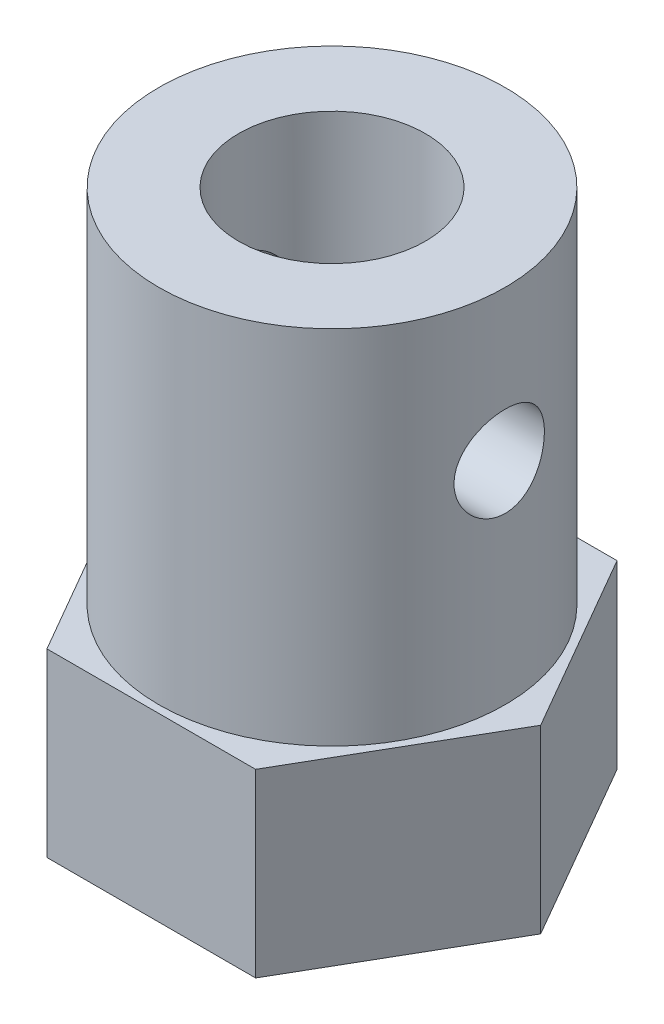
ISO-10303-21;
HEADER;
FILE_DESCRIPTION(('STEP AP214'),'2;1');
FILE_NAME('part.step','',(''),(''),'','','');
FILE_SCHEMA(('AUTOMOTIVE_DESIGN { 1 0 10303 214 1 1 1 1 }'));
ENDSEC;
DATA;
#1=APPLICATION_CONTEXT('core data for automotive mechanical design processes');
#2=APPLICATION_PROTOCOL_DEFINITION('international standard','automotive_design',2000,#1);
#3=PRODUCT_CONTEXT('',#1,'mechanical');
#4=PRODUCT('Part','Part','',(#3));
#5=PRODUCT_RELATED_PRODUCT_CATEGORY('part','',(#4));
#6=PRODUCT_DEFINITION_FORMATION('','',#4);
#7=PRODUCT_DEFINITION_CONTEXT('part definition',#1,'design');
#8=PRODUCT_DEFINITION('design','',#6,#7);
#9=PRODUCT_DEFINITION_SHAPE('','',#8);
#10=(LENGTH_UNIT() NAMED_UNIT(*) SI_UNIT(.MILLI.,.METRE.));
#11=(NAMED_UNIT(*) PLANE_ANGLE_UNIT() SI_UNIT($,.RADIAN.));
#12=(NAMED_UNIT(*) SI_UNIT($,.STERADIAN.) SOLID_ANGLE_UNIT());
#13=UNCERTAINTY_MEASURE_WITH_UNIT(LENGTH_MEASURE(1.E-05),#10,'distance_accuracy_value','');
#14=(GEOMETRIC_REPRESENTATION_CONTEXT(3) GLOBAL_UNCERTAINTY_ASSIGNED_CONTEXT((#13)) GLOBAL_UNIT_ASSIGNED_CONTEXT((#10,
#11,#12)) REPRESENTATION_CONTEXT('',''));
#15=CARTESIAN_POINT('',(0.,0.,0.));
#16=DIRECTION('',(0.,0.,1.));
#17=DIRECTION('',(1.,0.,0.));
#18=AXIS2_PLACEMENT_3D('',#15,#16,#17);
#19=CARTESIAN_POINT('',(0.,6.,0.));
#20=DIRECTION('',(0.,1.,0.));
#21=DIRECTION('',(0.,0.,1.));
#22=AXIS2_PLACEMENT_3D('',#19,#20,#21);
#23=PLANE('',#22);
#24=CARTESIAN_POINT('',(0.,6.,0.));
#25=DIRECTION('',(0.,1.,0.));
#26=DIRECTION('',(0.,0.,1.));
#27=AXIS2_PLACEMENT_3D('',#24,#25,#26);
#28=CIRCLE('',#27,1.5);
#29=CARTESIAN_POINT('',(0.,6.,1.5));
#30=VERTEX_POINT('',#29);
#31=EDGE_CURVE('E132',#30,#30,#28,.T.);
#32=ORIENTED_EDGE('',*,*,#31,.F.);
#33=EDGE_LOOP('',(#32));
#34=FACE_BOUND('',#33,.T.);
#35=CARTESIAN_POINT('',(0.,6.,0.));
#36=DIRECTION('',(0.,1.,0.));
#37=DIRECTION('',(0.,0.,1.));
#38=AXIS2_PLACEMENT_3D('',#35,#36,#37);
#39=CIRCLE('',#38,3.1);
#40=CARTESIAN_POINT('',(0.,6.,3.1));
#41=VERTEX_POINT('',#40);
#42=EDGE_CURVE('E218',#41,#41,#39,.T.);
#43=ORIENTED_EDGE('',*,*,#42,.T.);
#44=EDGE_LOOP('',(#43));
#45=FACE_BOUND('',#44,.T.);
#46=ADVANCED_FACE('F35',(#34,#45),#23,.T.);
#47=CARTESIAN_POINT('',(0.,6.,0.));
#48=DIRECTION('',(0.,1.,0.));
#49=DIRECTION('',(0.,0.,1.));
#50=AXIS2_PLACEMENT_3D('',#47,#48,#49);
#51=CIRCLE('',#50,5.75);
#52=CARTESIAN_POINT('',(0.,6.,5.75));
#53=VERTEX_POINT('',#52);
#54=EDGE_CURVE('E11',#53,#53,#51,.T.);
#55=ORIENTED_EDGE('',*,*,#54,.F.);
#56=EDGE_LOOP('',(#55));
#57=FACE_BOUND('',#56,.T.);
#58=DIRECTION('',(0.499999999999995,0.,-0.866025403784442));
#59=VECTOR('',#58,1.);
#60=CARTESIAN_POINT('',(3.46410161513783,6.,5.99999999999996));
#61=LINE('',#60,#59);
#62=CARTESIAN_POINT('',(3.46410161513783,6.,5.99999999999996));
#63=VERTEX_POINT('',#62);
#64=CARTESIAN_POINT('',(6.92820323027551,6.,0.));
#65=VERTEX_POINT('',#64);
#66=EDGE_CURVE('E139',#63,#65,#61,.T.);
#67=ORIENTED_EDGE('',*,*,#66,.T.);
#68=DIRECTION('',(-0.500000000000001,0.,-0.866025403784438));
#69=VECTOR('',#68,1.);
#70=CARTESIAN_POINT('',(6.92820323027551,6.,0.));
#71=LINE('',#70,#69);
#72=CARTESIAN_POINT('',(3.46410161513774,6.,-6.00000000000001));
#73=VERTEX_POINT('',#72);
#74=EDGE_CURVE('E97',#65,#73,#71,.T.);
#75=ORIENTED_EDGE('',*,*,#74,.T.);
#76=DIRECTION('',(-1.,0.,0.));
#77=VECTOR('',#76,1.);
#78=CARTESIAN_POINT('',(3.46410161513774,6.,-6.00000000000001));
#79=LINE('',#78,#77);
#80=CARTESIAN_POINT('',(-3.46410161513778,6.,-5.99999999999999));
#81=VERTEX_POINT('',#80);
#82=EDGE_CURVE('E110',#73,#81,#79,.T.);
#83=ORIENTED_EDGE('',*,*,#82,.T.);
#84=DIRECTION('',(-0.499999999999995,0.,0.866025403784442));
#85=VECTOR('',#84,1.);
#86=CARTESIAN_POINT('',(-3.46410161513778,6.,-5.99999999999999));
#87=LINE('',#86,#85);
#88=CARTESIAN_POINT('',(-6.92820323027551,6.,0.));
#89=VERTEX_POINT('',#88);
#90=EDGE_CURVE('E104',#81,#89,#87,.T.);
#91=ORIENTED_EDGE('',*,*,#90,.T.);
#92=DIRECTION('',(0.500000000000007,0.,0.866025403784434));
#93=VECTOR('',#92,1.);
#94=CARTESIAN_POINT('',(-6.92820323027551,6.,0.));
#95=LINE('',#94,#93);
#96=CARTESIAN_POINT('',(-3.4641016151377,6.,6.00000000000004));
#97=VERTEX_POINT('',#96);
#98=EDGE_CURVE('E108',#89,#97,#95,.T.);
#99=ORIENTED_EDGE('',*,*,#98,.T.);
#100=DIRECTION('',(1.,0.,0.));
#101=VECTOR('',#100,1.);
#102=CARTESIAN_POINT('',(-3.4641016151377,6.,6.00000000000004));
#103=LINE('',#102,#101);
#104=EDGE_CURVE('E59',#97,#63,#103,.T.);
#105=ORIENTED_EDGE('',*,*,#104,.T.);
#106=EDGE_LOOP('',(#67,#75,#83,#91,#99,#105));
#107=FACE_BOUND('',#106,.T.);
#108=ADVANCED_FACE('F106',(#57,#107),#23,.T.);
#109=CARTESIAN_POINT('',(0.,0.,0.));
#110=DIRECTION('',(0.,1.,0.));
#111=DIRECTION('',(0.,0.,1.));
#112=AXIS2_PLACEMENT_3D('',#109,#110,#111);
#113=PLANE('',#112);
#114=DIRECTION('',(0.499999999999995,0.,-0.866025403784442));
#115=VECTOR('',#114,1.);
#116=CARTESIAN_POINT('',(3.46410161513783,0.,5.99999999999996));
#117=LINE('',#116,#115);
#118=CARTESIAN_POINT('',(3.46410161513783,0.,5.99999999999996));
#119=VERTEX_POINT('',#118);
#120=CARTESIAN_POINT('',(6.92820323027551,0.,0.));
#121=VERTEX_POINT('',#120);
#122=EDGE_CURVE('E128',#119,#121,#117,.T.);
#123=ORIENTED_EDGE('',*,*,#122,.F.);
#124=DIRECTION('',(1.,0.,0.));
#125=VECTOR('',#124,1.);
#126=CARTESIAN_POINT('',(-3.4641016151377,0.,6.00000000000004));
#127=LINE('',#126,#125);
#128=CARTESIAN_POINT('',(-3.4641016151377,0.,6.00000000000004));
#129=VERTEX_POINT('',#128);
#130=EDGE_CURVE('E88',#129,#119,#127,.T.);
#131=ORIENTED_EDGE('',*,*,#130,.F.);
#132=DIRECTION('',(0.500000000000007,0.,0.866025403784434));
#133=VECTOR('',#132,1.);
#134=CARTESIAN_POINT('',(-6.92820323027551,0.,0.));
#135=LINE('',#134,#133);
#136=CARTESIAN_POINT('',(-6.92820323027551,0.,0.));
#137=VERTEX_POINT('',#136);
#138=EDGE_CURVE('E82',#137,#129,#135,.T.);
#139=ORIENTED_EDGE('',*,*,#138,.F.);
#140=DIRECTION('',(-0.499999999999995,0.,0.866025403784442));
#141=VECTOR('',#140,1.);
#142=CARTESIAN_POINT('',(-3.46410161513778,0.,-5.99999999999999));
#143=LINE('',#142,#141);
#144=CARTESIAN_POINT('',(-3.46410161513778,0.,-5.99999999999999));
#145=VERTEX_POINT('',#144);
#146=EDGE_CURVE('E118',#145,#137,#143,.T.);
#147=ORIENTED_EDGE('',*,*,#146,.F.);
#148=DIRECTION('',(-1.,0.,0.));
#149=VECTOR('',#148,1.);
#150=CARTESIAN_POINT('',(3.46410161513774,0.,-6.00000000000001));
#151=LINE('',#150,#149);
#152=CARTESIAN_POINT('',(3.46410161513774,0.,-6.00000000000001));
#153=VERTEX_POINT('',#152);
#154=EDGE_CURVE('E134',#153,#145,#151,.T.);
#155=ORIENTED_EDGE('',*,*,#154,.F.);
#156=DIRECTION('',(-0.500000000000001,0.,-0.866025403784438));
#157=VECTOR('',#156,1.);
#158=CARTESIAN_POINT('',(6.92820323027551,0.,0.));
#159=LINE('',#158,#157);
#160=EDGE_CURVE('E131',#121,#153,#159,.T.);
#161=ORIENTED_EDGE('',*,*,#160,.F.);
#162=EDGE_LOOP('',(#123,#131,#139,#147,#155,#161));
#163=FACE_BOUND('',#162,.T.);
#164=CARTESIAN_POINT('',(0.,0.,0.));
#165=DIRECTION('',(0.,1.,0.));
#166=DIRECTION('',(0.,0.,1.));
#167=AXIS2_PLACEMENT_3D('',#164,#165,#166);
#168=CIRCLE('',#167,1.5);
#169=CARTESIAN_POINT('',(0.,0.,1.5));
#170=VERTEX_POINT('',#169);
#171=EDGE_CURVE('E227',#170,#170,#168,.T.);
#172=ORIENTED_EDGE('',*,*,#171,.T.);
#173=EDGE_LOOP('',(#172));
#174=FACE_BOUND('',#173,.T.);
#175=ADVANCED_FACE('F189',(#163,#174),#113,.F.);
#176=CARTESIAN_POINT('',(3.46410161513783,6.,5.99999999999996));
#177=DIRECTION('',(-0.866025403784441,0.,-0.499999999999995));
#178=DIRECTION('',(-0.499999999999995,0.,0.866025403784442));
#179=AXIS2_PLACEMENT_3D('',#176,#177,#178);
#180=PLANE('',#179);
#181=ORIENTED_EDGE('',*,*,#122,.T.);
#182=DIRECTION('',(0.,-1.,0.));
#183=VECTOR('',#182,1.);
#184=CARTESIAN_POINT('',(6.92820323027551,6.,0.));
#185=LINE('',#184,#183);
#186=EDGE_CURVE('E50',#65,#121,#185,.T.);
#187=ORIENTED_EDGE('',*,*,#186,.F.);
#188=ORIENTED_EDGE('',*,*,#66,.F.);
#189=DIRECTION('',(0.,-1.,0.));
#190=VECTOR('',#189,1.);
#191=CARTESIAN_POINT('',(3.46410161513783,6.,5.99999999999996));
#192=LINE('',#191,#190);
#193=EDGE_CURVE('E124',#63,#119,#192,.T.);
#194=ORIENTED_EDGE('',*,*,#193,.T.);
#195=EDGE_LOOP('',(#181,#187,#188,#194));
#196=FACE_BOUND('',#195,.T.);
#197=ADVANCED_FACE('F37',(#196),#180,.F.);
#198=CARTESIAN_POINT('',(6.92820323027551,6.,0.));
#199=DIRECTION('',(-0.866025403784438,0.,0.500000000000001));
#200=DIRECTION('',(0.500000000000001,0.,0.866025403784438));
#201=AXIS2_PLACEMENT_3D('',#198,#199,#200);
#202=PLANE('',#201);
#203=ORIENTED_EDGE('',*,*,#160,.T.);
#204=DIRECTION('',(0.,-1.,0.));
#205=VECTOR('',#204,1.);
#206=CARTESIAN_POINT('',(3.46410161513774,6.,-6.00000000000001));
#207=LINE('',#206,#205);
#208=EDGE_CURVE('E143',#73,#153,#207,.T.);
#209=ORIENTED_EDGE('',*,*,#208,.F.);
#210=ORIENTED_EDGE('',*,*,#74,.F.);
#211=ORIENTED_EDGE('',*,*,#186,.T.);
#212=EDGE_LOOP('',(#203,#209,#210,#211));
#213=FACE_BOUND('',#212,.T.);
#214=ADVANCED_FACE('F202',(#213),#202,.F.);
#215=CARTESIAN_POINT('',(3.46410161513774,6.,-6.00000000000001));
#216=DIRECTION('',(0.,0.,1.));
#217=DIRECTION('',(1.,0.,0.));
#218=AXIS2_PLACEMENT_3D('',#215,#216,#217);
#219=PLANE('',#218);
#220=ORIENTED_EDGE('',*,*,#154,.T.);
#221=DIRECTION('',(0.,-1.,0.));
#222=VECTOR('',#221,1.);
#223=CARTESIAN_POINT('',(-3.46410161513778,6.,-5.99999999999999));
#224=LINE('',#223,#222);
#225=EDGE_CURVE('E119',#81,#145,#224,.T.);
#226=ORIENTED_EDGE('',*,*,#225,.F.);
#227=ORIENTED_EDGE('',*,*,#82,.F.);
#228=ORIENTED_EDGE('',*,*,#208,.T.);
#229=EDGE_LOOP('',(#220,#226,#227,#228));
#230=FACE_BOUND('',#229,.T.);
#231=ADVANCED_FACE('F200',(#230),#219,.F.);
#232=CARTESIAN_POINT('',(-3.46410161513778,6.,-5.99999999999999));
#233=DIRECTION('',(0.866025403784441,0.,0.499999999999995));
#234=DIRECTION('',(0.499999999999995,0.,-0.866025403784442));
#235=AXIS2_PLACEMENT_3D('',#232,#233,#234);
#236=PLANE('',#235);
#237=ORIENTED_EDGE('',*,*,#146,.T.);
#238=DIRECTION('',(0.,-1.,0.));
#239=VECTOR('',#238,1.);
#240=CARTESIAN_POINT('',(-6.92820323027551,6.,0.));
#241=LINE('',#240,#239);
#242=EDGE_CURVE('E115',#89,#137,#241,.T.);
#243=ORIENTED_EDGE('',*,*,#242,.F.);
#244=ORIENTED_EDGE('',*,*,#90,.F.);
#245=ORIENTED_EDGE('',*,*,#225,.T.);
#246=EDGE_LOOP('',(#237,#243,#244,#245));
#247=FACE_BOUND('',#246,.T.);
#248=ADVANCED_FACE('F116',(#247),#236,.F.);
#249=CARTESIAN_POINT('',(-6.92820323027551,6.,0.));
#250=DIRECTION('',(0.866025403784435,0.,-0.500000000000007));
#251=DIRECTION('',(-0.500000000000007,0.,-0.866025403784435));
#252=AXIS2_PLACEMENT_3D('',#249,#250,#251);
#253=PLANE('',#252);
#254=ORIENTED_EDGE('',*,*,#138,.T.);
#255=DIRECTION('',(0.,-1.,0.));
#256=VECTOR('',#255,1.);
#257=CARTESIAN_POINT('',(-3.4641016151377,6.,6.00000000000004));
#258=LINE('',#257,#256);
#259=EDGE_CURVE('E120',#97,#129,#258,.T.);
#260=ORIENTED_EDGE('',*,*,#259,.F.);
#261=ORIENTED_EDGE('',*,*,#98,.F.);
#262=ORIENTED_EDGE('',*,*,#242,.T.);
#263=EDGE_LOOP('',(#254,#260,#261,#262));
#264=FACE_BOUND('',#263,.T.);
#265=ADVANCED_FACE('F122',(#264),#253,.F.);
#266=CARTESIAN_POINT('',(-3.4641016151377,6.,6.00000000000004));
#267=DIRECTION('',(0.,0.,-1.));
#268=DIRECTION('',(-1.,0.,0.));
#269=AXIS2_PLACEMENT_3D('',#266,#267,#268);
#270=PLANE('',#269);
#271=ORIENTED_EDGE('',*,*,#130,.T.);
#272=ORIENTED_EDGE('',*,*,#193,.F.);
#273=ORIENTED_EDGE('',*,*,#104,.F.);
#274=ORIENTED_EDGE('',*,*,#259,.T.);
#275=EDGE_LOOP('',(#271,#272,#273,#274));
#276=FACE_BOUND('',#275,.T.);
#277=ADVANCED_FACE('F185',(#276),#270,.F.);
#278=CARTESIAN_POINT('',(0.,6.,0.));
#279=DIRECTION('',(0.,-1.,0.));
#280=DIRECTION('',(0.,0.,-1.));
#281=AXIS2_PLACEMENT_3D('',#278,#279,#280);
#282=CYLINDRICAL_SURFACE('',#281,1.5);
#283=ORIENTED_EDGE('',*,*,#31,.T.);
#284=EDGE_LOOP('',(#283));
#285=FACE_BOUND('',#284,.T.);
#286=ORIENTED_EDGE('',*,*,#171,.F.);
#287=EDGE_LOOP('',(#286));
#288=FACE_BOUND('',#287,.T.);
#289=ADVANCED_FACE('F181',(#285,#288),#282,.F.);
#290=CARTESIAN_POINT('',(0.,18.,0.));
#291=DIRECTION('',(0.,1.,0.));
#292=DIRECTION('',(0.,0.,1.));
#293=AXIS2_PLACEMENT_3D('',#290,#291,#292);
#294=PLANE('',#293);
#295=CARTESIAN_POINT('',(0.,18.,0.));
#296=DIRECTION('',(0.,1.,0.));
#297=DIRECTION('',(0.,0.,1.));
#298=AXIS2_PLACEMENT_3D('',#295,#296,#297);
#299=CIRCLE('',#298,5.75);
#300=CARTESIAN_POINT('',(0.,18.,5.75));
#301=VERTEX_POINT('',#300);
#302=EDGE_CURVE('E223',#301,#301,#299,.T.);
#303=ORIENTED_EDGE('',*,*,#302,.T.);
#304=EDGE_LOOP('',(#303));
#305=FACE_BOUND('',#304,.T.);
#306=CARTESIAN_POINT('',(0.,18.,0.));
#307=DIRECTION('',(0.,1.,0.));
#308=DIRECTION('',(0.,0.,1.));
#309=AXIS2_PLACEMENT_3D('',#306,#307,#308);
#310=CIRCLE('',#309,3.1);
#311=CARTESIAN_POINT('',(0.,18.,3.1));
#312=VERTEX_POINT('',#311);
#313=EDGE_CURVE('E220',#312,#312,#310,.T.);
#314=ORIENTED_EDGE('',*,*,#313,.F.);
#315=EDGE_LOOP('',(#314));
#316=FACE_BOUND('',#315,.T.);
#317=ADVANCED_FACE('F179',(#305,#316),#294,.T.);
#318=CARTESIAN_POINT('',(0.,18.,0.));
#319=DIRECTION('',(0.,-1.,0.));
#320=DIRECTION('',(0.,0.,-1.));
#321=AXIS2_PLACEMENT_3D('',#318,#319,#320);
#322=CYLINDRICAL_SURFACE('',#321,5.75);
#323=CARTESIAN_POINT('',(-5.55090082779363,13.,-1.5));
#324=CARTESIAN_POINT('',(-5.55090232081963,13.0827025118796,-1.49999787390871));
#325=CARTESIAN_POINT('',(-5.55276929440346,13.1654278772811,-1.49313699351389));
#326=CARTESIAN_POINT('',(-5.56001429429568,13.328494285914,-1.46592382093821));
#327=CARTESIAN_POINT('',(-5.56539418133612,13.4088340419363,-1.44556437870484));
#328=CARTESIAN_POINT('',(-5.57901516627788,13.5647468235353,-1.39206496813115));
#329=CARTESIAN_POINT('',(-5.58725235690885,13.6403261928731,-1.35894244606875));
#330=CARTESIAN_POINT('',(-5.60565488571894,13.7848659142589,-1.28091123512912));
#331=CARTESIAN_POINT('',(-5.61582034985967,13.8538258334577,-1.23600177621404));
#332=CARTESIAN_POINT('',(-5.63720669027579,13.9848203400384,-1.13452208252607));
#333=CARTESIAN_POINT('',(-5.64844563148391,14.0466729921918,-1.07772075709486));
#334=CARTESIAN_POINT('',(-5.67055638091198,14.1600908276964,-0.954566979277584));
#335=CARTESIAN_POINT('',(-5.68142815233586,14.2116549825083,-0.888213573111866));
#336=CARTESIAN_POINT('',(-5.70178058538213,14.3037856975123,-0.746582977248265));
#337=CARTESIAN_POINT('',(-5.71123744823346,14.3441721440468,-0.671184907061254));
#338=CARTESIAN_POINT('',(-5.72748767458969,14.4116276367408,-0.514381442504879));
#339=CARTESIAN_POINT('',(-5.73428146717266,14.4386988284544,-0.432977018402214));
#340=CARTESIAN_POINT('',(-5.74431235079744,14.4781686910732,-0.268369836538965));
#341=CARTESIAN_POINT('',(-5.74762430604319,14.4908766617071,-0.1852458849922));
#342=CARTESIAN_POINT('',(-5.75057979191644,14.5022316687055,-0.0179843371081629));
#343=CARTESIAN_POINT('',(-5.75022391112532,14.5008809610801,0.0661530944305818));
#344=CARTESIAN_POINT('',(-5.74593898657959,14.4843764114755,0.230903126609591));
#345=CARTESIAN_POINT('',(-5.74209642310203,14.4695566289211,0.311551783947848));
#346=CARTESIAN_POINT('',(-5.73137145288893,14.4270733267933,0.469175376981868));
#347=CARTESIAN_POINT('',(-5.72448887669112,14.3994090912151,0.546150107613409));
#348=CARTESIAN_POINT('',(-5.70832751550622,14.3317611105538,0.695103277024859));
#349=CARTESIAN_POINT('',(-5.6990263029229,14.2916613442095,0.767026490664263));
#350=CARTESIAN_POINT('',(-5.67903225460901,14.2003692607206,0.903237998902984));
#351=CARTESIAN_POINT('',(-5.66833915797082,14.1491748626962,0.967524857741455));
#352=CARTESIAN_POINT('',(-5.64635136172292,14.0353671462552,1.08863222457667));
#353=CARTESIAN_POINT('',(-5.63504821801647,13.9724622554754,1.14517751241556));
#354=CARTESIAN_POINT('',(-5.61339946204995,13.8379452148636,1.24698151059245));
#355=CARTESIAN_POINT('',(-5.60305390313033,13.7663325804967,1.29223959243559));
#356=CARTESIAN_POINT('',(-5.58445905522392,13.6158563577676,1.37038203776097));
#357=CARTESIAN_POINT('',(-5.57622200888616,13.5369538883825,1.40319464637715));
#358=CARTESIAN_POINT('',(-5.56293055858802,13.3744844829647,1.45500060536802));
#359=CARTESIAN_POINT('',(-5.55787540422025,13.2909186517895,1.47399721422912));
#360=CARTESIAN_POINT('',(-5.55167914004583,13.1240609452585,1.49716381835989));
#361=CARTESIAN_POINT('',(-5.55043002233498,13.0408298385871,1.50174307874068));
#362=CARTESIAN_POINT('',(-5.55169228644257,12.874791704668,1.49707006587458));
#363=CARTESIAN_POINT('',(-5.55420328747144,12.7919846353299,1.48781919321403));
#364=CARTESIAN_POINT('',(-5.56259882701457,12.6307016559855,1.45610863559891));
#365=CARTESIAN_POINT('',(-5.56842118691461,12.5521743674906,1.43389221391026));
#366=CARTESIAN_POINT('',(-5.58272327222094,12.3999598290562,1.37715336709783));
#367=CARTESIAN_POINT('',(-5.59120333344621,12.3262731921906,1.34262938675294));
#368=CARTESIAN_POINT('',(-5.61008904341343,12.1841116303205,1.26141546219601));
#369=CARTESIAN_POINT('',(-5.62053162663388,12.1157799033486,1.21448364010067));
#370=CARTESIAN_POINT('',(-5.6420775632124,11.9878114474233,1.11008819917511));
#371=CARTESIAN_POINT('',(-5.65318103499585,11.9281762834623,1.0526226889413));
#372=CARTESIAN_POINT('',(-5.67516745336205,11.8176094483759,0.926903287195877));
#373=CARTESIAN_POINT('',(-5.68603592780608,11.7669623765694,0.858396075371732));
#374=CARTESIAN_POINT('',(-5.70601331478824,11.6778887151307,0.713613484583691));
#375=CARTESIAN_POINT('',(-5.71512232063588,11.639461477377,0.637338517893222));
#376=CARTESIAN_POINT('',(-5.73049601619699,11.5762649912451,0.479720718704235));
#377=CARTESIAN_POINT('',(-5.73678165450386,11.5513948481437,0.398420480930011));
#378=CARTESIAN_POINT('',(-5.745892430293,11.5157219058226,0.232607146509003));
#379=CARTESIAN_POINT('',(-5.74871829927836,11.5049161329262,0.148094732913746));
#380=CARTESIAN_POINT('',(-5.75055825162258,11.4978582656111,-0.019079947133176));
#381=CARTESIAN_POINT('',(-5.74968190891557,11.5011878239951,-0.101723601520388));
#382=CARTESIAN_POINT('',(-5.74446199519655,11.5213394073171,-0.265231316357166));
#383=CARTESIAN_POINT('',(-5.74011854451027,11.5381609640163,-0.346095438465203));
#384=CARTESIAN_POINT('',(-5.72847252230552,11.5845866777533,-0.503268507616826));
#385=CARTESIAN_POINT('',(-5.72118886505798,11.6141092081108,-0.579603059324661));
#386=CARTESIAN_POINT('',(-5.70442589175086,11.6850256400348,-0.726278800625168));
#387=CARTESIAN_POINT('',(-5.69494627833792,11.7264211494965,-0.796619176783412));
#388=CARTESIAN_POINT('',(-5.67450404780893,11.8211511060026,-0.931270439941909));
#389=CARTESIAN_POINT('',(-5.66350955817485,11.8747652445582,-0.99537971119792));
#390=CARTESIAN_POINT('',(-5.64141065929338,11.9918756389475,-1.11383314693391));
#391=CARTESIAN_POINT('',(-5.63030622225617,12.0553744561532,-1.16817477248182));
#392=CARTESIAN_POINT('',(-5.60897994432222,12.1920402595224,-1.2666656342572));
#393=CARTESIAN_POINT('',(-5.59878125079338,12.2653807938219,-1.3105794960216));
#394=CARTESIAN_POINT('',(-5.58074232391792,12.4186604878402,-1.38539021145014));
#395=CARTESIAN_POINT('',(-5.5729004866524,12.4985951126335,-1.41629592335341));
#396=CARTESIAN_POINT('',(-5.56160088605531,12.6485762864125,-1.4599688276234));
#397=CARTESIAN_POINT('',(-5.55762000999737,12.7179478254287,-1.47494618353058));
#398=CARTESIAN_POINT('',(-5.55226947550379,12.8582074149736,-1.49496216858776));
#399=CARTESIAN_POINT('',(-5.55089954775333,12.9290953083301,-1.50000182279648));
#400=CARTESIAN_POINT('',(-5.55090082779363,13.,-1.5));
#401=B_SPLINE_CURVE_WITH_KNOTS('',3,(#323,#324,#325,#326,#327,#328,#329,#330,#331,#332,#333,
#334,#335,#336,#337,#338,#339,#340,#341,#342,#343,#344,#345,#346,#347,#348,#349,#350,#351,#352,
#353,#354,#355,#356,#357,#358,#359,#360,#361,#362,#363,#364,#365,#366,#367,#368,#369,#370,#371,
#372,#373,#374,#375,#376,#377,#378,#379,#380,#381,#382,#383,#384,#385,#386,#387,#388,#389,#390,
#391,#392,#393,#394,#395,#396,#397,#398,#399,#400),.UNSPECIFIED.,.T.,.F.,(4,2,2,2,2,2,2,2,2,2,2,
2,2,2,2,2,2,2,2,2,2,2,2,2,2,2,2,2,2,2,2,2,2,2,2,2,2,2,4),(0.,0.247846932213467,0.49582525145072,
0.743465796519598,0.991122523916576,1.24413298994995,1.49716873674027,1.75407149955015,
2.01093285275295,2.26215074877579,2.51332833223609,2.75844131790607,3.00356796886319,
3.25105414713942,3.49858678350027,3.75340001453818,4.00822743093465,4.26450250455337,
4.52071711639577,4.76958977198248,5.01843722578485,5.26275935549397,5.50711236945145,
5.75663370302619,6.00619988401493,6.26263234557327,6.51905120407021,6.77353474031641,
7.02796446151302,7.27491743805458,7.52186184448271,7.76724235555625,8.01265611292845,
8.26438206043911,8.51617334546956,8.77319910700255,9.03004955584013,9.24256212496342,
9.4550527725935),.UNSPECIFIED.);
#402=CARTESIAN_POINT('',(-5.55090082779363,13.,-1.5));
#403=VERTEX_POINT('',#402);
#404=EDGE_CURVE('E170',#403,#403,#401,.T.);
#405=ORIENTED_EDGE('',*,*,#404,.T.);
#406=EDGE_LOOP('',(#405));
#407=FACE_BOUND('',#406,.T.);
#408=CARTESIAN_POINT('',(5.55090082779363,13.,-1.5));
#409=CARTESIAN_POINT('',(5.55090232081963,12.9172974881204,-1.49999787390871));
#410=CARTESIAN_POINT('',(5.55276929440346,12.8345721227189,-1.49313699351389));
#411=CARTESIAN_POINT('',(5.56001429429568,12.671505714086,-1.46592382093821));
#412=CARTESIAN_POINT('',(5.56539418133612,12.5911659580637,-1.44556437870484));
#413=CARTESIAN_POINT('',(5.57901516627788,12.4352531764647,-1.39206496813115));
#414=CARTESIAN_POINT('',(5.58725235690885,12.3596738071269,-1.35894244606875));
#415=CARTESIAN_POINT('',(5.60565488571894,12.2151340857411,-1.28091123512912));
#416=CARTESIAN_POINT('',(5.61582034985967,12.1461741665423,-1.23600177621404));
#417=CARTESIAN_POINT('',(5.63720669027579,12.0151796599616,-1.13452208252607));
#418=CARTESIAN_POINT('',(5.64844563148391,11.9533270078082,-1.07772075709486));
#419=CARTESIAN_POINT('',(5.67055638091198,11.8399091723036,-0.954566979277584));
#420=CARTESIAN_POINT('',(5.68142815233586,11.7883450174917,-0.888213573111866));
#421=CARTESIAN_POINT('',(5.70178058538213,11.6962143024877,-0.746582977248265));
#422=CARTESIAN_POINT('',(5.71123744823346,11.6558278559532,-0.671184907061254));
#423=CARTESIAN_POINT('',(5.72748767458969,11.5883723632592,-0.514381442504879));
#424=CARTESIAN_POINT('',(5.73428146717266,11.5613011715456,-0.432977018402214));
#425=CARTESIAN_POINT('',(5.74431235079744,11.5218313089268,-0.268369836538965));
#426=CARTESIAN_POINT('',(5.74762430604319,11.5091233382929,-0.1852458849922));
#427=CARTESIAN_POINT('',(5.75057979191644,11.4977683312945,-0.0179843371081629));
#428=CARTESIAN_POINT('',(5.75022391112532,11.4991190389199,0.0661530944305818));
#429=CARTESIAN_POINT('',(5.74593898657959,11.5156235885245,0.230903126609591));
#430=CARTESIAN_POINT('',(5.74209642310203,11.5304433710789,0.311551783947848));
#431=CARTESIAN_POINT('',(5.73137145288893,11.5729266732067,0.469175376981868));
#432=CARTESIAN_POINT('',(5.72448887669112,11.6005909087849,0.546150107613409));
#433=CARTESIAN_POINT('',(5.70832751550622,11.6682388894462,0.695103277024859));
#434=CARTESIAN_POINT('',(5.6990263029229,11.7083386557905,0.767026490664263));
#435=CARTESIAN_POINT('',(5.67903225460901,11.7996307392794,0.903237998902984));
#436=CARTESIAN_POINT('',(5.66833915797082,11.8508251373038,0.967524857741455));
#437=CARTESIAN_POINT('',(5.64635136172292,11.9646328537448,1.08863222457667));
#438=CARTESIAN_POINT('',(5.63504821801647,12.0275377445246,1.14517751241556));
#439=CARTESIAN_POINT('',(5.61339946204995,12.1620547851364,1.24698151059245));
#440=CARTESIAN_POINT('',(5.60305390313033,12.2336674195033,1.29223959243559));
#441=CARTESIAN_POINT('',(5.58445905522392,12.3841436422324,1.37038203776097));
#442=CARTESIAN_POINT('',(5.57622200888616,12.4630461116175,1.40319464637715));
#443=CARTESIAN_POINT('',(5.56293055858802,12.6255155170353,1.45500060536802));
#444=CARTESIAN_POINT('',(5.55787540422025,12.7090813482105,1.47399721422912));
#445=CARTESIAN_POINT('',(5.55167914004583,12.8759390547415,1.49716381835989));
#446=CARTESIAN_POINT('',(5.55043002233498,12.9591701614129,1.50174307874068));
#447=CARTESIAN_POINT('',(5.55169228644257,13.125208295332,1.49707006587458));
#448=CARTESIAN_POINT('',(5.55420328747144,13.2080153646701,1.48781919321403));
#449=CARTESIAN_POINT('',(5.56259882701457,13.3692983440145,1.45610863559891));
#450=CARTESIAN_POINT('',(5.56842118691461,13.4478256325094,1.43389221391026));
#451=CARTESIAN_POINT('',(5.58272327222094,13.6000401709438,1.37715336709783));
#452=CARTESIAN_POINT('',(5.59120333344621,13.6737268078094,1.34262938675294));
#453=CARTESIAN_POINT('',(5.61008904341343,13.8158883696795,1.26141546219601));
#454=CARTESIAN_POINT('',(5.62053162663388,13.8842200966514,1.21448364010067));
#455=CARTESIAN_POINT('',(5.6420775632124,14.0121885525767,1.11008819917511));
#456=CARTESIAN_POINT('',(5.65318103499585,14.0718237165378,1.05262268894129));
#457=CARTESIAN_POINT('',(5.67516745336205,14.1823905516241,0.926903287195877));
#458=CARTESIAN_POINT('',(5.68603592780608,14.2330376234306,0.858396075371732));
#459=CARTESIAN_POINT('',(5.70601331478824,14.3221112848693,0.713613484583691));
#460=CARTESIAN_POINT('',(5.71512232063588,14.360538522623,0.637338517893222));
#461=CARTESIAN_POINT('',(5.73049601619699,14.4237350087549,0.479720718704235));
#462=CARTESIAN_POINT('',(5.73678165450386,14.4486051518563,0.39842048093001));
#463=CARTESIAN_POINT('',(5.745892430293,14.4842780941774,0.232607146509002));
#464=CARTESIAN_POINT('',(5.74871829927836,14.4950838670738,0.148094732913746));
#465=CARTESIAN_POINT('',(5.75055825162258,14.5021417343889,-0.019079947133176));
#466=CARTESIAN_POINT('',(5.74968190891557,14.4988121760049,-0.101723601520388));
#467=CARTESIAN_POINT('',(5.74446199519655,14.4786605926829,-0.265231316357166));
#468=CARTESIAN_POINT('',(5.74011854451027,14.4618390359837,-0.346095438465203));
#469=CARTESIAN_POINT('',(5.72847252230552,14.4154133222467,-0.503268507616826));
#470=CARTESIAN_POINT('',(5.72118886505798,14.3858907918892,-0.579603059324661));
#471=CARTESIAN_POINT('',(5.70442589175086,14.3149743599653,-0.726278800625168));
#472=CARTESIAN_POINT('',(5.69494627833792,14.2735788505035,-0.796619176783412));
#473=CARTESIAN_POINT('',(5.67450404780893,14.1788488939974,-0.931270439941908));
#474=CARTESIAN_POINT('',(5.66350955817485,14.1252347554418,-0.995379711197919));
#475=CARTESIAN_POINT('',(5.64141065929338,14.0081243610525,-1.11383314693391));
#476=CARTESIAN_POINT('',(5.63030622225617,13.9446255438468,-1.16817477248182));
#477=CARTESIAN_POINT('',(5.60897994432222,13.8079597404776,-1.2666656342572));
#478=CARTESIAN_POINT('',(5.59878125079338,13.7346192061781,-1.3105794960216));
#479=CARTESIAN_POINT('',(5.58074232391792,13.5813395121598,-1.38539021145014));
#480=CARTESIAN_POINT('',(5.5729004866524,13.5014048873665,-1.41629592335341));
#481=CARTESIAN_POINT('',(5.56160088605531,13.3514237135875,-1.4599688276234));
#482=CARTESIAN_POINT('',(5.55762000999737,13.2820521745713,-1.47494618353058));
#483=CARTESIAN_POINT('',(5.55226947550379,13.1417925850264,-1.49496216858776));
#484=CARTESIAN_POINT('',(5.55089954775333,13.0709046916699,-1.50000182279648));
#485=CARTESIAN_POINT('',(5.55090082779363,13.,-1.5));
#486=B_SPLINE_CURVE_WITH_KNOTS('',3,(#408,#409,#410,#411,#412,#413,#414,#415,#416,#417,#418,
#419,#420,#421,#422,#423,#424,#425,#426,#427,#428,#429,#430,#431,#432,#433,#434,#435,#436,#437,
#438,#439,#440,#441,#442,#443,#444,#445,#446,#447,#448,#449,#450,#451,#452,#453,#454,#455,#456,
#457,#458,#459,#460,#461,#462,#463,#464,#465,#466,#467,#468,#469,#470,#471,#472,#473,#474,#475,
#476,#477,#478,#479,#480,#481,#482,#483,#484,#485),.UNSPECIFIED.,.T.,.F.,(4,2,2,2,2,2,2,2,2,2,2,
2,2,2,2,2,2,2,2,2,2,2,2,2,2,2,2,2,2,2,2,2,2,2,2,2,2,2,4),(0.,0.247846932213467,0.49582525145072,
0.743465796519596,0.991122523916576,1.24413298994995,1.49716873674027,1.75407149955015,
2.01093285275295,2.26215074877579,2.51332833223609,2.75844131790607,3.00356796886319,
3.25105414713942,3.49858678350027,3.75340001453818,4.00822743093465,4.26450250455337,
4.52071711639577,4.76958977198248,5.01843722578485,5.26275935549397,5.50711236945145,
5.75663370302619,6.00619988401493,6.26263234557327,6.51905120407021,6.77353474031641,
7.02796446151302,7.27491743805458,7.52186184448271,7.76724235555625,8.01265611292845,
8.26438206043911,8.51617334546956,8.77319910700255,9.03004955584013,9.24256212496342,
9.4550527725935),.UNSPECIFIED.);
#487=CARTESIAN_POINT('',(5.55090082779363,13.,-1.5));
#488=VERTEX_POINT('',#487);
#489=EDGE_CURVE('E164',#488,#488,#486,.T.);
#490=ORIENTED_EDGE('',*,*,#489,.T.);
#491=EDGE_LOOP('',(#490));
#492=FACE_BOUND('',#491,.T.);
#493=ORIENTED_EDGE('',*,*,#302,.F.);
#494=EDGE_LOOP('',(#493));
#495=FACE_BOUND('',#494,.T.);
#496=ORIENTED_EDGE('',*,*,#54,.T.);
#497=EDGE_LOOP('',(#496));
#498=FACE_BOUND('',#497,.T.);
#499=ADVANCED_FACE('F175',(#407,#492,#495,#498),#322,.T.);
#500=CARTESIAN_POINT('',(0.,18.,0.));
#501=DIRECTION('',(0.,-1.,0.));
#502=DIRECTION('',(0.,0.,-1.));
#503=AXIS2_PLACEMENT_3D('',#500,#501,#502);
#504=CYLINDRICAL_SURFACE('',#503,3.1);
#505=CARTESIAN_POINT('',(-2.71293199325011,13.,-1.5));
#506=CARTESIAN_POINT('',(-2.71293810602707,13.0785466190489,-1.49999492059757));
#507=CARTESIAN_POINT('',(-2.71639437877482,13.1572010979134,-1.49378977985908));
#508=CARTESIAN_POINT('',(-2.72972979584767,13.3121268096355,-1.46927137742174));
#509=CARTESIAN_POINT('',(-2.73962329586937,13.3883923154249,-1.45093105142698));
#510=CARTESIAN_POINT('',(-2.76442252776009,13.5360104557441,-1.4030976209863));
#511=CARTESIAN_POINT('',(-2.7793028937549,13.6073857945719,-1.37366086619922));
#512=CARTESIAN_POINT('',(-2.81236022577533,13.744167543615,-1.30464150179683));
#513=CARTESIAN_POINT('',(-2.83053718481149,13.8095739664851,-1.26505891369269));
#514=CARTESIAN_POINT('',(-2.86985264094388,13.9381288898871,-1.17329480013247));
#515=CARTESIAN_POINT('',(-2.89111140167802,14.0007160087334,-1.12037798569234));
#516=CARTESIAN_POINT('',(-2.93322157526014,14.1165592753543,-1.00497971934906));
#517=CARTESIAN_POINT('',(-2.95407279148337,14.169811013306,-0.942493773175669));
#518=CARTESIAN_POINT('',(-2.99457001608098,14.2687047128331,-0.804980520744669));
#519=CARTESIAN_POINT('',(-3.01406059193925,14.3136680786481,-0.729415143076342));
#520=CARTESIAN_POINT('',(-3.04809814226509,14.389990278621,-0.57067389312141));
#521=CARTESIAN_POINT('',(-3.06264804171259,14.4213571652207,-0.487502560865867));
#522=CARTESIAN_POINT('',(-3.08430127904169,14.4674121349187,-0.321847709467145));
#523=CARTESIAN_POINT('',(-3.09184014117435,14.483081247722,-0.239695127397445));
#524=CARTESIAN_POINT('',(-3.10023882355099,14.5005142175406,-0.0736068203923163));
#525=CARTESIAN_POINT('',(-3.10110239470556,14.5022858836739,0.0103278765621611));
#526=CARTESIAN_POINT('',(-3.09627020423456,14.4922805692293,0.17027324970091));
#527=CARTESIAN_POINT('',(-3.09110371985573,14.4815969190373,0.246371834339658));
#528=CARTESIAN_POINT('',(-3.07557700513506,14.4489237110783,0.395538468369625));
#529=CARTESIAN_POINT('',(-3.06521638788366,14.4269333110715,0.468606291561162));
#530=CARTESIAN_POINT('',(-3.04007288157933,14.3720945793857,0.610951104347792));
#531=CARTESIAN_POINT('',(-3.02522825824131,14.339093952707,0.680158065694272));
#532=CARTESIAN_POINT('',(-2.99247817620383,14.263364640628,0.812225689942346));
#533=CARTESIAN_POINT('',(-2.97457160394644,14.2206324141938,0.875084030725966));
#534=CARTESIAN_POINT('',(-2.9355013363418,14.1222242480428,0.99870062036054));
#535=CARTESIAN_POINT('',(-2.91418954377451,14.065729600631,1.05876095216352));
#536=CARTESIAN_POINT('',(-2.87178037530514,13.9436105636561,1.16891768527135));
#537=CARTESIAN_POINT('',(-2.85068315560029,13.8779799719361,1.21900726107665));
#538=CARTESIAN_POINT('',(-2.80982104768052,13.7348812140856,1.31055794759544));
#539=CARTESIAN_POINT('',(-2.79019907829767,13.6569533844546,1.35137051946412));
#540=CARTESIAN_POINT('',(-2.75642605801252,13.494154978374,1.41899941443367));
#541=CARTESIAN_POINT('',(-2.74226961836549,13.4092913408643,1.44582953272961));
#542=CARTESIAN_POINT('',(-2.72253482573975,13.2419640079642,1.48263666296822));
#543=CARTESIAN_POINT('',(-2.71637771942639,13.1598223116837,1.49375661147253));
#544=CARTESIAN_POINT('',(-2.71168425392407,12.9946341778727,1.50226461760217));
#545=CARTESIAN_POINT('',(-2.71314324594875,12.9115883231189,1.49966105190683));
#546=CARTESIAN_POINT('',(-2.72290566354281,12.7557134756923,1.48184467777125));
#547=CARTESIAN_POINT('',(-2.73051559969672,12.6826883387706,1.4679086290649));
#548=CARTESIAN_POINT('',(-2.75072559786317,12.5401340335372,1.42967569872823));
#549=CARTESIAN_POINT('',(-2.76332715574048,12.4706059202418,1.40537571111578));
#550=CARTESIAN_POINT('',(-2.7927932466317,12.3333656467137,1.3459017726769));
#551=CARTESIAN_POINT('',(-2.80982847144386,12.265887492483,1.31027553001639));
#552=CARTESIAN_POINT('',(-2.84607243783817,12.1374863450809,1.2295640127949));
#553=CARTESIAN_POINT('',(-2.86528227864574,12.0765666977324,1.18447394453352));
#554=CARTESIAN_POINT('',(-2.90640342115472,11.9555929312464,1.07996442995556));
#555=CARTESIAN_POINT('',(-2.92836871534928,11.8964665217204,1.01948756982411));
#556=CARTESIAN_POINT('',(-2.97056031612546,11.788935518112,0.889081601811071));
#557=CARTESIAN_POINT('',(-2.99078614869189,11.7405338409633,0.819149930698388));
#558=CARTESIAN_POINT('',(-3.02777065360343,11.6550417163606,0.669801398703177));
#559=CARTESIAN_POINT('',(-3.04445053122811,11.6182010695642,0.590220688077679));
#560=CARTESIAN_POINT('',(-3.07187356547455,11.5587827344077,0.424953967870415));
#561=CARTESIAN_POINT('',(-3.08262160180212,11.5361933203715,0.339273042215534));
#562=CARTESIAN_POINT('',(-3.09623602551114,11.5077479012071,0.17236773997227));
#563=CARTESIAN_POINT('',(-3.099711970682,11.5005959807145,0.0914132929018959));
#564=CARTESIAN_POINT('',(-3.10025308480683,11.4994762388257,-0.0705970615455868));
#565=CARTESIAN_POINT('',(-3.0973202193951,11.5055043749992,-0.151652930195125));
#566=CARTESIAN_POINT('',(-3.08572788901491,11.5296878864898,-0.306535872374835));
#567=CARTESIAN_POINT('',(-3.07741733526782,11.5471050106366,-0.380506967606489));
#568=CARTESIAN_POINT('',(-3.05619391816196,11.5926175539226,-0.524375894010134));
#569=CARTESIAN_POINT('',(-3.04328035300466,11.6207146014205,-0.594273102164778));
#570=CARTESIAN_POINT('',(-3.01332001683357,11.6881128500991,-0.731472536634641));
#571=CARTESIAN_POINT('',(-2.9961154438214,11.7278553825869,-0.798522504117894));
#572=CARTESIAN_POINT('',(-2.95942590784808,11.8168497696559,-0.925289323220526));
#573=CARTESIAN_POINT('',(-2.93993989882688,11.8661059931324,-0.985002785063891));
#574=CARTESIAN_POINT('',(-2.89850357205403,11.9781008895886,-1.10128775860753));
#575=CARTESIAN_POINT('',(-2.87649347823812,12.0416705873503,-1.15704001821865));
#576=CARTESIAN_POINT('',(-2.83408562289403,12.1776796270469,-1.25735148728903));
#577=CARTESIAN_POINT('',(-2.81368914756881,12.2501259295331,-1.30190182818343));
#578=CARTESIAN_POINT('',(-2.77658650994691,12.4040715724344,-1.37929552477));
#579=CARTESIAN_POINT('',(-2.7599725949942,12.4857365286417,-1.41185622470861));
#580=CARTESIAN_POINT('',(-2.73360384914068,12.6543898667148,-1.4622728069576));
#581=CARTESIAN_POINT('',(-2.72382602374533,12.7413593219111,-1.48017802084133));
#582=CARTESIAN_POINT('',(-2.7165154455489,12.8576358542283,-1.49350264095651));
#583=CARTESIAN_POINT('',(-2.71517570481292,12.8860322254294,-1.49593586787793));
#584=CARTESIAN_POINT('',(-2.71338284202488,12.9429476484937,-1.4991855180506));
#585=CARTESIAN_POINT('',(-2.71292977268791,12.9714667075501,-1.50000184517267));
#586=CARTESIAN_POINT('',(-2.71293199325011,13.,-1.5));
#587=B_SPLINE_CURVE_WITH_KNOTS('',3,(#505,#506,#507,#508,#509,#510,#511,#512,#513,#514,#515,
#516,#517,#518,#519,#520,#521,#522,#523,#524,#525,#526,#527,#528,#529,#530,#531,#532,#533,#534,
#535,#536,#537,#538,#539,#540,#541,#542,#543,#544,#545,#546,#547,#548,#549,#550,#551,#552,#553,
#554,#555,#556,#557,#558,#559,#560,#561,#562,#563,#564,#565,#566,#567,#568,#569,#570,#571,#572,
#573,#574,#575,#576,#577,#578,#579,#580,#581,#582,#583,#584,#585,#586),.UNSPECIFIED.,.T.,.F.,(4,
2,2,2,2,2,2,2,2,2,2,2,2,2,2,2,2,2,2,2,2,2,2,2,2,2,2,2,2,2,2,2,2,2,2,2,2,2,2,2,4),(0.,
0.235519909494816,0.471566861867468,0.706430929695081,0.941294499568247,1.19423736348462,
1.4472993918053,1.7160884568173,1.98471811471995,2.23525571200081,2.48565251954049,
2.71562530273618,2.94561521908867,3.17892825434239,3.41232632115822,3.66672597203251,
3.9212991782552,4.19027593547098,4.45898681336751,4.70691557051381,4.95469301225538,
5.1778852290003,5.4011443815597,5.63476423123155,5.86850270291336,6.12947262056348,
6.39051343043701,6.65685802537525,6.92298318964468,7.16572463042057,7.40839163087321,
7.6367080116984,7.8650592176999,8.10352972246076,8.34210999959678,8.6030549964481,
8.86420593768663,9.13116977898829,9.39723125898447,9.48278247736158,9.56833878184367),.UNSPECIFIED.);
#588=CARTESIAN_POINT('',(-2.71293199325011,13.,-1.5));
#589=VERTEX_POINT('',#588);
#590=EDGE_CURVE('E39',#589,#589,#587,.T.);
#591=ORIENTED_EDGE('',*,*,#590,.F.);
#592=EDGE_LOOP('',(#591));
#593=FACE_BOUND('',#592,.T.);
#594=CARTESIAN_POINT('',(2.71293199325011,13.,-1.5));
#595=CARTESIAN_POINT('',(2.71293810602707,12.9214533809511,-1.49999492059757));
#596=CARTESIAN_POINT('',(2.71639437877482,12.8427989020866,-1.49378977985908));
#597=CARTESIAN_POINT('',(2.72972979584767,12.6878731903645,-1.46927137742174));
#598=CARTESIAN_POINT('',(2.73962329586937,12.6116076845751,-1.45093105142698));
#599=CARTESIAN_POINT('',(2.76442252776009,12.4639895442559,-1.4030976209863));
#600=CARTESIAN_POINT('',(2.7793028937549,12.3926142054281,-1.37366086619922));
#601=CARTESIAN_POINT('',(2.81236022577533,12.255832456385,-1.30464150179683));
#602=CARTESIAN_POINT('',(2.83053718481149,12.1904260335149,-1.26505891369269));
#603=CARTESIAN_POINT('',(2.86985264094388,12.0618711101129,-1.17329480013247));
#604=CARTESIAN_POINT('',(2.89111140167802,11.9992839912666,-1.12037798569234));
#605=CARTESIAN_POINT('',(2.93322157526014,11.8834407246457,-1.00497971934906));
#606=CARTESIAN_POINT('',(2.95407279148337,11.830188986694,-0.942493773175669));
#607=CARTESIAN_POINT('',(2.99457001608098,11.7312952871669,-0.804980520744669));
#608=CARTESIAN_POINT('',(3.01406059193925,11.6863319213519,-0.729415143076342));
#609=CARTESIAN_POINT('',(3.04809814226509,11.610009721379,-0.57067389312141));
#610=CARTESIAN_POINT('',(3.06264804171259,11.5786428347794,-0.487502560865867));
#611=CARTESIAN_POINT('',(3.08430127904169,11.5325878650813,-0.321847709467145));
#612=CARTESIAN_POINT('',(3.09184014117435,11.516918752278,-0.239695127397445));
#613=CARTESIAN_POINT('',(3.10023882355099,11.4994857824594,-0.0736068203923163));
#614=CARTESIAN_POINT('',(3.10110239470556,11.4977141163261,0.0103278765621611));
#615=CARTESIAN_POINT('',(3.09627020423456,11.5077194307707,0.17027324970091));
#616=CARTESIAN_POINT('',(3.09110371985573,11.5184030809627,0.246371834339658));
#617=CARTESIAN_POINT('',(3.07557700513506,11.5510762889217,0.395538468369625));
#618=CARTESIAN_POINT('',(3.06521638788366,11.5730666889285,0.468606291561162));
#619=CARTESIAN_POINT('',(3.04007288157933,11.6279054206143,0.610951104347792));
#620=CARTESIAN_POINT('',(3.02522825824131,11.660906047293,0.680158065694272));
#621=CARTESIAN_POINT('',(2.99247817620383,11.736635359372,0.812225689942346));
#622=CARTESIAN_POINT('',(2.97457160394644,11.7793675858062,0.875084030725966));
#623=CARTESIAN_POINT('',(2.9355013363418,11.8777757519572,0.99870062036054));
#624=CARTESIAN_POINT('',(2.91418954377451,11.934270399369,1.05876095216352));
#625=CARTESIAN_POINT('',(2.87178037530514,12.0563894363439,1.16891768527135));
#626=CARTESIAN_POINT('',(2.85068315560029,12.1220200280639,1.21900726107665));
#627=CARTESIAN_POINT('',(2.80982104768052,12.2651187859144,1.31055794759544));
#628=CARTESIAN_POINT('',(2.79019907829767,12.3430466155454,1.35137051946412));
#629=CARTESIAN_POINT('',(2.75642605801252,12.505845021626,1.41899941443367));
#630=CARTESIAN_POINT('',(2.74226961836549,12.5907086591357,1.44582953272961));
#631=CARTESIAN_POINT('',(2.72253482573975,12.7580359920358,1.48263666296822));
#632=CARTESIAN_POINT('',(2.71637771942639,12.8401776883163,1.49375661147253));
#633=CARTESIAN_POINT('',(2.71168425392407,13.0053658221273,1.50226461760217));
#634=CARTESIAN_POINT('',(2.71314324594875,13.0884116768811,1.49966105190683));
#635=CARTESIAN_POINT('',(2.72290566354281,13.2442865243077,1.48184467777125));
#636=CARTESIAN_POINT('',(2.73051559969672,13.3173116612294,1.4679086290649));
#637=CARTESIAN_POINT('',(2.75072559786317,13.4598659664628,1.42967569872823));
#638=CARTESIAN_POINT('',(2.76332715574048,13.5293940797582,1.40537571111578));
#639=CARTESIAN_POINT('',(2.7927932466317,13.6666343532863,1.3459017726769));
#640=CARTESIAN_POINT('',(2.80982847144386,13.734112507517,1.31027553001639));
#641=CARTESIAN_POINT('',(2.84607243783817,13.8625136549191,1.2295640127949));
#642=CARTESIAN_POINT('',(2.86528227864574,13.9234333022676,1.18447394453352));
#643=CARTESIAN_POINT('',(2.90640342115472,14.0444070687536,1.07996442995556));
#644=CARTESIAN_POINT('',(2.92836871534928,14.1035334782796,1.01948756982411));
#645=CARTESIAN_POINT('',(2.97056031612546,14.211064481888,0.88908160181107));
#646=CARTESIAN_POINT('',(2.99078614869189,14.2594661590367,0.819149930698388));
#647=CARTESIAN_POINT('',(3.02777065360343,14.3449582836394,0.669801398703177));
#648=CARTESIAN_POINT('',(3.04445053122811,14.3817989304358,0.590220688077679));
#649=CARTESIAN_POINT('',(3.07187356547455,14.4412172655923,0.424953967870415));
#650=CARTESIAN_POINT('',(3.08262160180212,14.4638066796285,0.339273042215534));
#651=CARTESIAN_POINT('',(3.09623602551114,14.4922520987929,0.17236773997227));
#652=CARTESIAN_POINT('',(3.099711970682,14.4994040192855,0.0914132929018959));
#653=CARTESIAN_POINT('',(3.10025308480683,14.5005237611744,-0.0705970615455868));
#654=CARTESIAN_POINT('',(3.0973202193951,14.4944956250008,-0.151652930195125));
#655=CARTESIAN_POINT('',(3.08572788901491,14.4703121135102,-0.306535872374835));
#656=CARTESIAN_POINT('',(3.07741733526782,14.4528949893634,-0.380506967606489));
#657=CARTESIAN_POINT('',(3.05619391816196,14.4073824460774,-0.524375894010134));
#658=CARTESIAN_POINT('',(3.04328035300466,14.3792853985795,-0.594273102164778));
#659=CARTESIAN_POINT('',(3.01332001683357,14.3118871499009,-0.731472536634641));
#660=CARTESIAN_POINT('',(2.9961154438214,14.2721446174131,-0.798522504117894));
#661=CARTESIAN_POINT('',(2.95942590784808,14.1831502303441,-0.925289323220526));
#662=CARTESIAN_POINT('',(2.93993989882688,14.1338940068676,-0.985002785063891));
#663=CARTESIAN_POINT('',(2.89850357205403,14.0218991104114,-1.10128775860753));
#664=CARTESIAN_POINT('',(2.87649347823812,13.9583294126497,-1.15704001821865));
#665=CARTESIAN_POINT('',(2.83408562289403,13.8223203729531,-1.25735148728903));
#666=CARTESIAN_POINT('',(2.81368914756881,13.7498740704669,-1.30190182818343));
#667=CARTESIAN_POINT('',(2.77658650994691,13.5959284275656,-1.37929552477));
#668=CARTESIAN_POINT('',(2.7599725949942,13.5142634713583,-1.41185622470861));
#669=CARTESIAN_POINT('',(2.73360384914068,13.3456101332852,-1.4622728069576));
#670=CARTESIAN_POINT('',(2.72382602374533,13.2586406780889,-1.48017802084133));
#671=CARTESIAN_POINT('',(2.7165154455489,13.1423641457717,-1.49350264095651));
#672=CARTESIAN_POINT('',(2.71517570481292,13.1139677745706,-1.49593586787793));
#673=CARTESIAN_POINT('',(2.71338284202488,13.0570523515063,-1.4991855180506));
#674=CARTESIAN_POINT('',(2.71292977268791,13.0285332924499,-1.50000184517267));
#675=CARTESIAN_POINT('',(2.71293199325011,13.,-1.5));
#676=B_SPLINE_CURVE_WITH_KNOTS('',3,(#594,#595,#596,#597,#598,#599,#600,#601,#602,#603,#604,
#605,#606,#607,#608,#609,#610,#611,#612,#613,#614,#615,#616,#617,#618,#619,#620,#621,#622,#623,
#624,#625,#626,#627,#628,#629,#630,#631,#632,#633,#634,#635,#636,#637,#638,#639,#640,#641,#642,
#643,#644,#645,#646,#647,#648,#649,#650,#651,#652,#653,#654,#655,#656,#657,#658,#659,#660,#661,
#662,#663,#664,#665,#666,#667,#668,#669,#670,#671,#672,#673,#674,#675),.UNSPECIFIED.,.T.,.F.,(4,
2,2,2,2,2,2,2,2,2,2,2,2,2,2,2,2,2,2,2,2,2,2,2,2,2,2,2,2,2,2,2,2,2,2,2,2,2,2,2,4),(0.,
0.235519909494816,0.471566861867468,0.706430929695081,0.941294499568247,1.19423736348462,
1.4472993918053,1.7160884568173,1.98471811471995,2.23525571200081,2.48565251954049,
2.71562530273618,2.94561521908867,3.17892825434239,3.41232632115822,3.66672597203251,
3.9212991782552,4.19027593547097,4.45898681336751,4.70691557051381,4.95469301225538,
5.17788522900029,5.4011443815597,5.63476423123155,5.86850270291336,6.12947262056348,
6.39051343043701,6.65685802537525,6.92298318964468,7.16572463042057,7.40839163087321,
7.6367080116984,7.86505921769989,8.10352972246076,8.34210999959678,8.60305499644809,
8.86420593768663,9.13116977898829,9.39723125898446,9.48278247736158,9.56833878184367),.UNSPECIFIED.);
#677=CARTESIAN_POINT('',(2.71293199325011,13.,-1.5));
#678=VERTEX_POINT('',#677);
#679=EDGE_CURVE('E146',#678,#678,#676,.T.);
#680=ORIENTED_EDGE('',*,*,#679,.F.);
#681=EDGE_LOOP('',(#680));
#682=FACE_BOUND('',#681,.T.);
#683=ORIENTED_EDGE('',*,*,#313,.T.);
#684=EDGE_LOOP('',(#683));
#685=FACE_BOUND('',#684,.T.);
#686=ORIENTED_EDGE('',*,*,#42,.F.);
#687=EDGE_LOOP('',(#686));
#688=FACE_BOUND('',#687,.T.);
#689=ADVANCED_FACE('F151',(#593,#682,#685,#688),#504,.F.);
#690=CARTESIAN_POINT('',(-6.,13.,0.));
#691=DIRECTION('',(1.,0.,0.));
#692=DIRECTION('',(0.,0.,-1.));
#693=AXIS2_PLACEMENT_3D('',#690,#691,#692);
#694=CYLINDRICAL_SURFACE('',#693,1.5);
#695=ORIENTED_EDGE('',*,*,#679,.T.);
#696=EDGE_LOOP('',(#695));
#697=FACE_BOUND('',#696,.T.);
#698=ORIENTED_EDGE('',*,*,#489,.F.);
#699=EDGE_LOOP('',(#698));
#700=FACE_BOUND('',#699,.T.);
#701=ADVANCED_FACE('F157',(#697,#700),#694,.F.);
#702=ORIENTED_EDGE('',*,*,#590,.T.);
#703=EDGE_LOOP('',(#702));
#704=FACE_BOUND('',#703,.T.);
#705=ORIENTED_EDGE('',*,*,#404,.F.);
#706=EDGE_LOOP('',(#705));
#707=FACE_BOUND('',#706,.T.);
#708=ADVANCED_FACE('F154',(#704,#707),#694,.F.);
#709=CLOSED_SHELL('',(#46,#108,#175,#197,#214,#231,#248,#265,#277,#289,#317,#499,#689,#701,#708));
#710=MANIFOLD_SOLID_BREP('B2',#709);
#711=ADVANCED_BREP_SHAPE_REPRESENTATION('',(#18,#710),#14);
#712=SHAPE_DEFINITION_REPRESENTATION(#9,#711);
ENDSEC;
END-ISO-10303-21;
